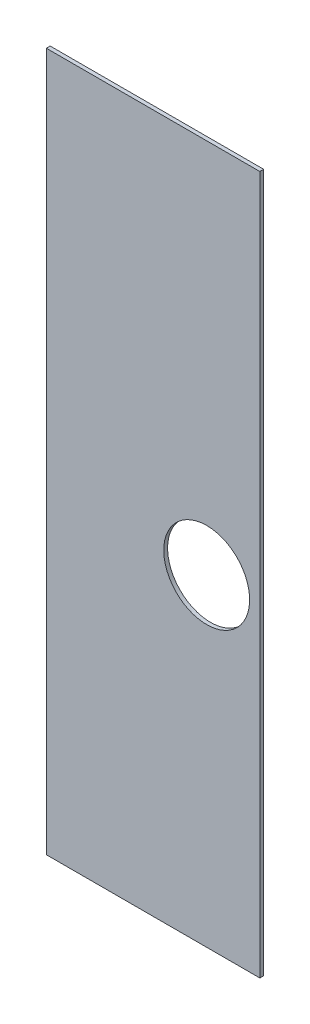
ISO-10303-21;
HEADER;
FILE_DESCRIPTION(('STEP AP214'),'2;1');
FILE_NAME('part.step','',(''),(''),'','','');
FILE_SCHEMA(('AUTOMOTIVE_DESIGN { 1 0 10303 214 1 1 1 1 }'));
ENDSEC;
DATA;
#1=APPLICATION_CONTEXT('core data for automotive mechanical design processes');
#2=APPLICATION_PROTOCOL_DEFINITION('international standard','automotive_design',2000,#1);
#3=PRODUCT_CONTEXT('',#1,'mechanical');
#4=PRODUCT('Part','Part','',(#3));
#5=PRODUCT_RELATED_PRODUCT_CATEGORY('part','',(#4));
#6=PRODUCT_DEFINITION_FORMATION('','',#4);
#7=PRODUCT_DEFINITION_CONTEXT('part definition',#1,'design');
#8=PRODUCT_DEFINITION('design','',#6,#7);
#9=PRODUCT_DEFINITION_SHAPE('','',#8);
#10=(LENGTH_UNIT() NAMED_UNIT(*) SI_UNIT(.MILLI.,.METRE.));
#11=(NAMED_UNIT(*) PLANE_ANGLE_UNIT() SI_UNIT($,.RADIAN.));
#12=(NAMED_UNIT(*) SI_UNIT($,.STERADIAN.) SOLID_ANGLE_UNIT());
#13=UNCERTAINTY_MEASURE_WITH_UNIT(LENGTH_MEASURE(1.E-05),#10,'distance_accuracy_value','');
#14=(GEOMETRIC_REPRESENTATION_CONTEXT(3) GLOBAL_UNCERTAINTY_ASSIGNED_CONTEXT((#13)) GLOBAL_UNIT_ASSIGNED_CONTEXT((#10,
#11,#12)) REPRESENTATION_CONTEXT('',''));
#15=CARTESIAN_POINT('',(0.,0.,0.));
#16=DIRECTION('',(0.,0.,1.));
#17=DIRECTION('',(1.,0.,0.));
#18=AXIS2_PLACEMENT_3D('',#15,#16,#17);
#19=CARTESIAN_POINT('',(-49.7355,0.,0.));
#20=DIRECTION('',(-1.,0.,0.));
#21=DIRECTION('',(0.,0.,1.));
#22=AXIS2_PLACEMENT_3D('',#19,#20,#21);
#23=PLANE('',#22);
#24=DIRECTION('',(0.,1.,0.));
#25=VECTOR('',#24,1.);
#26=CARTESIAN_POINT('',(-49.7355,0.,0.));
#27=LINE('',#26,#25);
#28=CARTESIAN_POINT('',(-49.7355,162.705,0.));
#29=VERTEX_POINT('',#28);
#30=CARTESIAN_POINT('',(-49.7355,-162.705,0.));
#31=VERTEX_POINT('',#30);
#32=EDGE_CURVE('E85',#29,#31,#27,.F.);
#33=ORIENTED_EDGE('',*,*,#32,.T.);
#34=DIRECTION('',(0.,0.,1.));
#35=VECTOR('',#34,1.);
#36=CARTESIAN_POINT('',(-49.7355,-162.705,0.));
#37=LINE('',#36,#35);
#38=CARTESIAN_POINT('',(-49.7355,-162.705,1.786));
#39=VERTEX_POINT('',#38);
#40=EDGE_CURVE('E81',#31,#39,#37,.T.);
#41=ORIENTED_EDGE('',*,*,#40,.T.);
#42=DIRECTION('',(0.,1.,0.));
#43=VECTOR('',#42,1.);
#44=CARTESIAN_POINT('',(-49.7355,0.,1.786));
#45=LINE('',#44,#43);
#46=CARTESIAN_POINT('',(-49.7355,162.705,1.786));
#47=VERTEX_POINT('',#46);
#48=EDGE_CURVE('E74',#39,#47,#45,.T.);
#49=ORIENTED_EDGE('',*,*,#48,.T.);
#50=DIRECTION('',(0.,0.,-1.));
#51=VECTOR('',#50,1.);
#52=CARTESIAN_POINT('',(-49.7355,162.705,0.));
#53=LINE('',#52,#51);
#54=EDGE_CURVE('E54',#47,#29,#53,.T.);
#55=ORIENTED_EDGE('',*,*,#54,.T.);
#56=EDGE_LOOP('',(#33,#41,#49,#55));
#57=FACE_BOUND('',#56,.T.);
#58=ADVANCED_FACE('F17',(#57),#23,.T.);
#59=CARTESIAN_POINT('',(0.,-162.705,0.));
#60=DIRECTION('',(0.,1.,0.));
#61=DIRECTION('',(0.,0.,1.));
#62=AXIS2_PLACEMENT_3D('',#59,#60,#61);
#63=PLANE('',#62);
#64=DIRECTION('',(1.,0.,0.));
#65=VECTOR('',#64,1.);
#66=CARTESIAN_POINT('',(0.,-162.705,0.));
#67=LINE('',#66,#65);
#68=CARTESIAN_POINT('',(49.7355,-162.705,0.));
#69=VERTEX_POINT('',#68);
#70=EDGE_CURVE('E89',#31,#69,#67,.T.);
#71=ORIENTED_EDGE('',*,*,#70,.T.);
#72=DIRECTION('',(0.,0.,-1.));
#73=VECTOR('',#72,1.);
#74=CARTESIAN_POINT('',(49.7355,-162.705,0.));
#75=LINE('',#74,#73);
#76=CARTESIAN_POINT('',(49.7355,-162.705,1.786));
#77=VERTEX_POINT('',#76);
#78=EDGE_CURVE('E79',#69,#77,#75,.F.);
#79=ORIENTED_EDGE('',*,*,#78,.T.);
#80=DIRECTION('',(1.,0.,0.));
#81=VECTOR('',#80,1.);
#82=CARTESIAN_POINT('',(0.,-162.705,1.786));
#83=LINE('',#82,#81);
#84=EDGE_CURVE('E72',#77,#39,#83,.F.);
#85=ORIENTED_EDGE('',*,*,#84,.T.);
#86=ORIENTED_EDGE('',*,*,#40,.F.);
#87=EDGE_LOOP('',(#71,#79,#85,#86));
#88=FACE_BOUND('',#87,.T.);
#89=ADVANCED_FACE('F88',(#88),#63,.F.);
#90=CARTESIAN_POINT('',(49.7355,0.,0.));
#91=DIRECTION('',(1.,0.,0.));
#92=DIRECTION('',(0.,0.,-1.));
#93=AXIS2_PLACEMENT_3D('',#90,#91,#92);
#94=PLANE('',#93);
#95=DIRECTION('',(0.,1.,0.));
#96=VECTOR('',#95,1.);
#97=CARTESIAN_POINT('',(49.7355,0.,0.));
#98=LINE('',#97,#96);
#99=CARTESIAN_POINT('',(49.7355,162.705,0.));
#100=VERTEX_POINT('',#99);
#101=EDGE_CURVE('E33',#69,#100,#98,.T.);
#102=ORIENTED_EDGE('',*,*,#101,.T.);
#103=DIRECTION('',(0.,0.,-1.));
#104=VECTOR('',#103,1.);
#105=CARTESIAN_POINT('',(49.7355,162.705,0.));
#106=LINE('',#105,#104);
#107=CARTESIAN_POINT('',(49.7355,162.705,1.786));
#108=VERTEX_POINT('',#107);
#109=EDGE_CURVE('E57',#100,#108,#106,.F.);
#110=ORIENTED_EDGE('',*,*,#109,.T.);
#111=DIRECTION('',(0.,1.,0.));
#112=VECTOR('',#111,1.);
#113=CARTESIAN_POINT('',(49.7355,0.,1.786));
#114=LINE('',#113,#112);
#115=EDGE_CURVE('E60',#108,#77,#114,.F.);
#116=ORIENTED_EDGE('',*,*,#115,.T.);
#117=ORIENTED_EDGE('',*,*,#78,.F.);
#118=EDGE_LOOP('',(#102,#110,#116,#117));
#119=FACE_BOUND('',#118,.T.);
#120=ADVANCED_FACE('F58',(#119),#94,.T.);
#121=CARTESIAN_POINT('',(0.,162.705,0.));
#122=DIRECTION('',(0.,-1.,0.));
#123=DIRECTION('',(0.,0.,-1.));
#124=AXIS2_PLACEMENT_3D('',#121,#122,#123);
#125=PLANE('',#124);
#126=DIRECTION('',(1.,0.,0.));
#127=VECTOR('',#126,1.);
#128=CARTESIAN_POINT('',(0.,162.705,0.));
#129=LINE('',#128,#127);
#130=EDGE_CURVE('E94',#100,#29,#129,.F.);
#131=ORIENTED_EDGE('',*,*,#130,.T.);
#132=ORIENTED_EDGE('',*,*,#54,.F.);
#133=DIRECTION('',(1.,0.,0.));
#134=VECTOR('',#133,1.);
#135=CARTESIAN_POINT('',(0.,162.705,1.786));
#136=LINE('',#135,#134);
#137=EDGE_CURVE('E63',#47,#108,#136,.T.);
#138=ORIENTED_EDGE('',*,*,#137,.T.);
#139=ORIENTED_EDGE('',*,*,#109,.F.);
#140=EDGE_LOOP('',(#131,#132,#138,#139));
#141=FACE_BOUND('',#140,.T.);
#142=ADVANCED_FACE('F66',(#141),#125,.F.);
#143=CARTESIAN_POINT('',(0.,0.,1.786));
#144=DIRECTION('',(0.,0.,1.));
#145=DIRECTION('',(1.,0.,0.));
#146=AXIS2_PLACEMENT_3D('',#143,#144,#145);
#147=PLANE('',#146);
#148=CARTESIAN_POINT('',(24.97489236,-12.495,1.786));
#149=DIRECTION('',(0.,0.,-1.));
#150=DIRECTION('',(0.,1.,0.));
#151=AXIS2_PLACEMENT_3D('',#148,#149,#150);
#152=CIRCLE('',#151,19.9999999957408);
#153=CARTESIAN_POINT('',(24.97489236,7.50499999574076,1.786));
#154=VERTEX_POINT('',#153);
#155=EDGE_CURVE('E20',#154,#154,#152,.T.);
#156=ORIENTED_EDGE('',*,*,#155,.T.);
#157=EDGE_LOOP('',(#156));
#158=FACE_BOUND('',#157,.T.);
#159=ORIENTED_EDGE('',*,*,#84,.F.);
#160=ORIENTED_EDGE('',*,*,#115,.F.);
#161=ORIENTED_EDGE('',*,*,#137,.F.);
#162=ORIENTED_EDGE('',*,*,#48,.F.);
#163=EDGE_LOOP('',(#159,#160,#161,#162));
#164=FACE_BOUND('',#163,.T.);
#165=ADVANCED_FACE('F70',(#158,#164),#147,.T.);
#166=CARTESIAN_POINT('',(0.,0.,0.));
#167=DIRECTION('',(0.,0.,1.));
#168=DIRECTION('',(1.,0.,0.));
#169=AXIS2_PLACEMENT_3D('',#166,#167,#168);
#170=PLANE('',#169);
#171=CARTESIAN_POINT('',(24.97489236,-12.495,0.));
#172=DIRECTION('',(0.,0.,-1.));
#173=DIRECTION('',(0.,1.,0.));
#174=AXIS2_PLACEMENT_3D('',#171,#172,#173);
#175=CIRCLE('',#174,19.9999999957408);
#176=CARTESIAN_POINT('',(24.97489236,7.50499999574076,0.));
#177=VERTEX_POINT('',#176);
#178=EDGE_CURVE('E11',#177,#177,#175,.F.);
#179=ORIENTED_EDGE('',*,*,#178,.T.);
#180=EDGE_LOOP('',(#179));
#181=FACE_BOUND('',#180,.T.);
#182=ORIENTED_EDGE('',*,*,#101,.F.);
#183=ORIENTED_EDGE('',*,*,#70,.F.);
#184=ORIENTED_EDGE('',*,*,#32,.F.);
#185=ORIENTED_EDGE('',*,*,#130,.F.);
#186=EDGE_LOOP('',(#182,#183,#184,#185));
#187=FACE_BOUND('',#186,.T.);
#188=ADVANCED_FACE('F101',(#181,#187),#170,.F.);
#189=CARTESIAN_POINT('',(24.97489236,-12.495,1.786));
#190=DIRECTION('',(0.,0.,-1.));
#191=DIRECTION('',(0.,1.,0.));
#192=AXIS2_PLACEMENT_3D('',#189,#190,#191);
#193=CYLINDRICAL_SURFACE('',#192,19.9999999957408);
#194=ORIENTED_EDGE('',*,*,#178,.F.);
#195=EDGE_LOOP('',(#194));
#196=FACE_BOUND('',#195,.T.);
#197=ORIENTED_EDGE('',*,*,#155,.F.);
#198=EDGE_LOOP('',(#197));
#199=FACE_BOUND('',#198,.T.);
#200=ADVANCED_FACE('F99',(#196,#199),#193,.F.);
#201=CLOSED_SHELL('',(#58,#89,#120,#142,#165,#188,#200));
#202=MANIFOLD_SOLID_BREP('B1',#201);
#203=ADVANCED_BREP_SHAPE_REPRESENTATION('',(#18,#202),#14);
#204=SHAPE_DEFINITION_REPRESENTATION(#9,#203);
ENDSEC;
END-ISO-10303-21;
